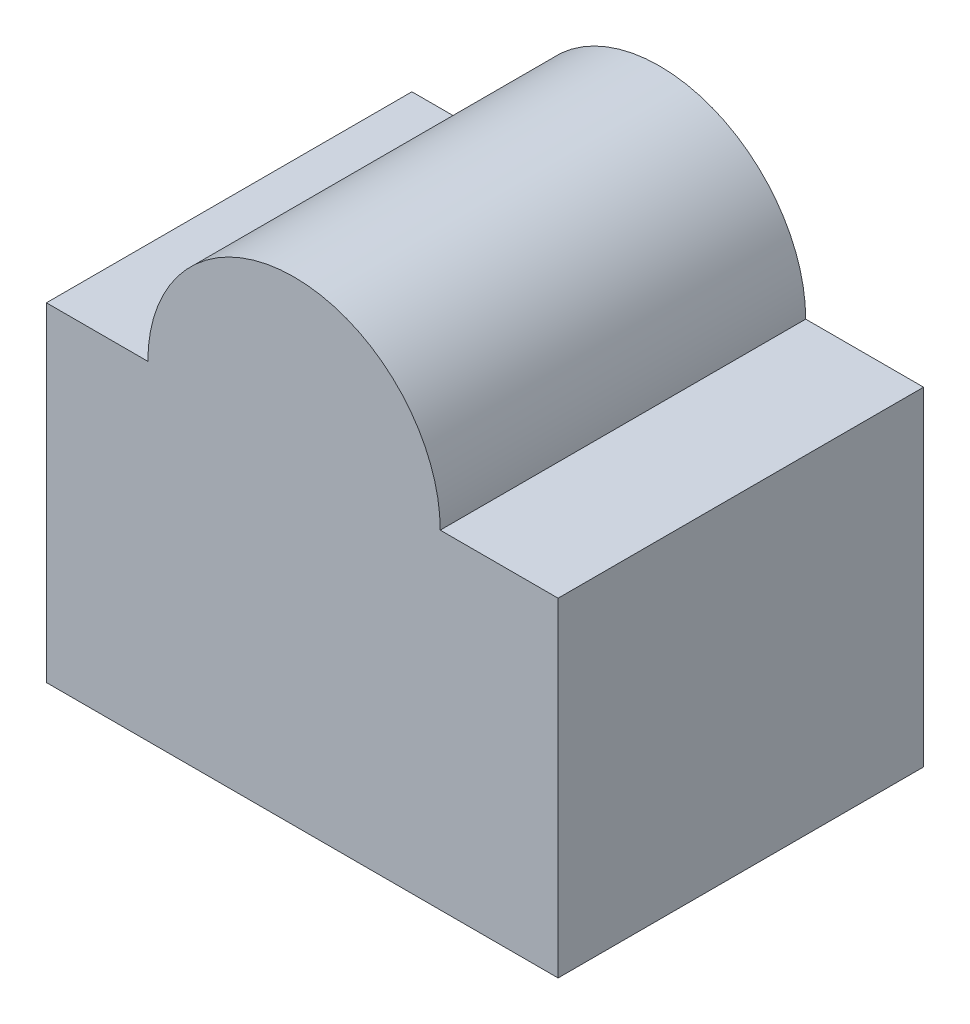
ISO-10303-21;
HEADER;
FILE_DESCRIPTION(('STEP AP214'),'2;1');
FILE_NAME('part.step','',(''),(''),'','','');
FILE_SCHEMA(('AUTOMOTIVE_DESIGN { 1 0 10303 214 1 1 1 1 }'));
ENDSEC;
DATA;
#1=APPLICATION_CONTEXT('core data for automotive mechanical design processes');
#2=APPLICATION_PROTOCOL_DEFINITION('international standard','automotive_design',2000,#1);
#3=PRODUCT_CONTEXT('',#1,'mechanical');
#4=PRODUCT('Part','Part','',(#3));
#5=PRODUCT_RELATED_PRODUCT_CATEGORY('part','',(#4));
#6=PRODUCT_DEFINITION_FORMATION('','',#4);
#7=PRODUCT_DEFINITION_CONTEXT('part definition',#1,'design');
#8=PRODUCT_DEFINITION('design','',#6,#7);
#9=PRODUCT_DEFINITION_SHAPE('','',#8);
#10=(LENGTH_UNIT() NAMED_UNIT(*) SI_UNIT(.MILLI.,.METRE.));
#11=(NAMED_UNIT(*) PLANE_ANGLE_UNIT() SI_UNIT($,.RADIAN.));
#12=(NAMED_UNIT(*) SI_UNIT($,.STERADIAN.) SOLID_ANGLE_UNIT());
#13=UNCERTAINTY_MEASURE_WITH_UNIT(LENGTH_MEASURE(1.E-05),#10,'distance_accuracy_value','');
#14=(GEOMETRIC_REPRESENTATION_CONTEXT(3) GLOBAL_UNCERTAINTY_ASSIGNED_CONTEXT((#13)) GLOBAL_UNIT_ASSIGNED_CONTEXT((#10,
#11,#12)) REPRESENTATION_CONTEXT('',''));
#15=CARTESIAN_POINT('',(0.,0.,0.));
#16=DIRECTION('',(0.,0.,1.));
#17=DIRECTION('',(1.,0.,0.));
#18=AXIS2_PLACEMENT_3D('',#15,#16,#17);
#19=CARTESIAN_POINT('',(0.,0.,500.));
#20=DIRECTION('',(1.,0.,0.));
#21=DIRECTION('',(0.,0.,-1.));
#22=AXIS2_PLACEMENT_3D('',#19,#20,#21);
#23=PLANE('',#22);
#24=DIRECTION('',(0.,-1.,0.));
#25=VECTOR('',#24,1.);
#26=CARTESIAN_POINT('',(0.,0.,0.));
#27=LINE('',#26,#25);
#28=CARTESIAN_POINT('',(0.,450.,0.));
#29=VERTEX_POINT('',#28);
#30=CARTESIAN_POINT('',(0.,0.,0.));
#31=VERTEX_POINT('',#30);
#32=EDGE_CURVE('E117',#29,#31,#27,.T.);
#33=ORIENTED_EDGE('',*,*,#32,.T.);
#34=DIRECTION('',(0.,0.,-1.));
#35=VECTOR('',#34,1.);
#36=CARTESIAN_POINT('',(0.,0.,500.));
#37=LINE('',#36,#35);
#38=CARTESIAN_POINT('',(0.,0.,500.));
#39=VERTEX_POINT('',#38);
#40=EDGE_CURVE('E11',#39,#31,#37,.T.);
#41=ORIENTED_EDGE('',*,*,#40,.F.);
#42=DIRECTION('',(0.,-1.,0.));
#43=VECTOR('',#42,1.);
#44=CARTESIAN_POINT('',(0.,0.,500.));
#45=LINE('',#44,#43);
#46=CARTESIAN_POINT('',(0.,450.,500.));
#47=VERTEX_POINT('',#46);
#48=EDGE_CURVE('E127',#47,#39,#45,.T.);
#49=ORIENTED_EDGE('',*,*,#48,.F.);
#50=DIRECTION('',(0.,0.,-1.));
#51=VECTOR('',#50,1.);
#52=CARTESIAN_POINT('',(0.,450.,500.));
#53=LINE('',#52,#51);
#54=EDGE_CURVE('E113',#47,#29,#53,.T.);
#55=ORIENTED_EDGE('',*,*,#54,.T.);
#56=EDGE_LOOP('',(#33,#41,#49,#55));
#57=FACE_BOUND('',#56,.T.);
#58=ADVANCED_FACE('F33',(#57),#23,.F.);
#59=CARTESIAN_POINT('',(0.,0.,500.));
#60=DIRECTION('',(0.,1.,0.));
#61=DIRECTION('',(0.,0.,1.));
#62=AXIS2_PLACEMENT_3D('',#59,#60,#61);
#63=PLANE('',#62);
#64=DIRECTION('',(1.,0.,0.));
#65=VECTOR('',#64,1.);
#66=CARTESIAN_POINT('',(0.,0.,0.));
#67=LINE('',#66,#65);
#68=CARTESIAN_POINT('',(700.,0.,0.));
#69=VERTEX_POINT('',#68);
#70=EDGE_CURVE('E120',#31,#69,#67,.T.);
#71=ORIENTED_EDGE('',*,*,#70,.T.);
#72=DIRECTION('',(0.,0.,-1.));
#73=VECTOR('',#72,1.);
#74=CARTESIAN_POINT('',(700.,0.,500.));
#75=LINE('',#74,#73);
#76=CARTESIAN_POINT('',(700.,0.,500.));
#77=VERTEX_POINT('',#76);
#78=EDGE_CURVE('E41',#77,#69,#75,.T.);
#79=ORIENTED_EDGE('',*,*,#78,.F.);
#80=DIRECTION('',(1.,0.,0.));
#81=VECTOR('',#80,1.);
#82=CARTESIAN_POINT('',(0.,0.,500.));
#83=LINE('',#82,#81);
#84=EDGE_CURVE('E86',#39,#77,#83,.T.);
#85=ORIENTED_EDGE('',*,*,#84,.F.);
#86=ORIENTED_EDGE('',*,*,#40,.T.);
#87=EDGE_LOOP('',(#71,#79,#85,#86));
#88=FACE_BOUND('',#87,.T.);
#89=ADVANCED_FACE('F151',(#88),#63,.F.);
#90=CARTESIAN_POINT('',(700.,0.,500.));
#91=DIRECTION('',(-1.,0.,0.));
#92=DIRECTION('',(0.,0.,1.));
#93=AXIS2_PLACEMENT_3D('',#90,#91,#92);
#94=PLANE('',#93);
#95=DIRECTION('',(0.,1.,0.));
#96=VECTOR('',#95,1.);
#97=CARTESIAN_POINT('',(700.,0.,0.));
#98=LINE('',#97,#96);
#99=CARTESIAN_POINT('',(700.,450.,0.));
#100=VERTEX_POINT('',#99);
#101=EDGE_CURVE('E122',#69,#100,#98,.T.);
#102=ORIENTED_EDGE('',*,*,#101,.T.);
#103=DIRECTION('',(0.,0.,-1.));
#104=VECTOR('',#103,1.);
#105=CARTESIAN_POINT('',(700.,450.,500.));
#106=LINE('',#105,#104);
#107=CARTESIAN_POINT('',(700.,450.,500.));
#108=VERTEX_POINT('',#107);
#109=EDGE_CURVE('E108',#108,#100,#106,.T.);
#110=ORIENTED_EDGE('',*,*,#109,.F.);
#111=DIRECTION('',(0.,1.,0.));
#112=VECTOR('',#111,1.);
#113=CARTESIAN_POINT('',(700.,0.,500.));
#114=LINE('',#113,#112);
#115=EDGE_CURVE('E99',#77,#108,#114,.T.);
#116=ORIENTED_EDGE('',*,*,#115,.F.);
#117=ORIENTED_EDGE('',*,*,#78,.T.);
#118=EDGE_LOOP('',(#102,#110,#116,#117));
#119=FACE_BOUND('',#118,.T.);
#120=ADVANCED_FACE('F133',(#119),#94,.F.);
#121=CARTESIAN_POINT('',(700.,450.,500.));
#122=DIRECTION('',(0.,-1.,0.));
#123=DIRECTION('',(0.,0.,-1.));
#124=AXIS2_PLACEMENT_3D('',#121,#122,#123);
#125=PLANE('',#124);
#126=DIRECTION('',(-1.,0.,0.));
#127=VECTOR('',#126,1.);
#128=CARTESIAN_POINT('',(700.,450.,0.));
#129=LINE('',#128,#127);
#130=CARTESIAN_POINT('',(538.758062096895,450.,0.));
#131=VERTEX_POINT('',#130);
#132=EDGE_CURVE('E107',#100,#131,#129,.T.);
#133=ORIENTED_EDGE('',*,*,#132,.T.);
#134=DIRECTION('',(0.,0.,-1.));
#135=VECTOR('',#134,1.);
#136=CARTESIAN_POINT('',(538.758062096895,450.,500.));
#137=LINE('',#136,#135);
#138=CARTESIAN_POINT('',(538.758062096895,450.,500.));
#139=VERTEX_POINT('',#138);
#140=EDGE_CURVE('E104',#139,#131,#137,.T.);
#141=ORIENTED_EDGE('',*,*,#140,.F.);
#142=DIRECTION('',(-1.,0.,0.));
#143=VECTOR('',#142,1.);
#144=CARTESIAN_POINT('',(700.,450.,500.));
#145=LINE('',#144,#143);
#146=EDGE_CURVE('E93',#108,#139,#145,.T.);
#147=ORIENTED_EDGE('',*,*,#146,.F.);
#148=ORIENTED_EDGE('',*,*,#109,.T.);
#149=EDGE_LOOP('',(#133,#141,#147,#148));
#150=FACE_BOUND('',#149,.T.);
#151=ADVANCED_FACE('F105',(#150),#125,.F.);
#152=CARTESIAN_POINT('',(338.758062096895,450.,500.));
#153=DIRECTION('',(0.,0.,-1.));
#154=DIRECTION('',(-1.,0.,0.));
#155=AXIS2_PLACEMENT_3D('',#152,#153,#154);
#156=CYLINDRICAL_SURFACE('',#155,200.);
#157=CARTESIAN_POINT('',(338.758062096895,450.,0.));
#158=DIRECTION('',(0.,0.,1.));
#159=DIRECTION('',(1.,0.,0.));
#160=AXIS2_PLACEMENT_3D('',#157,#158,#159);
#161=CIRCLE('',#160,200.);
#162=CARTESIAN_POINT('',(138.758062096895,450.,0.));
#163=VERTEX_POINT('',#162);
#164=EDGE_CURVE('E72',#131,#163,#161,.T.);
#165=ORIENTED_EDGE('',*,*,#164,.T.);
#166=DIRECTION('',(0.,0.,-1.));
#167=VECTOR('',#166,1.);
#168=CARTESIAN_POINT('',(138.758062096895,450.,500.));
#169=LINE('',#168,#167);
#170=CARTESIAN_POINT('',(138.758062096895,450.,500.));
#171=VERTEX_POINT('',#170);
#172=EDGE_CURVE('E109',#171,#163,#169,.T.);
#173=ORIENTED_EDGE('',*,*,#172,.F.);
#174=CARTESIAN_POINT('',(338.758062096895,450.,500.));
#175=DIRECTION('',(0.,0.,1.));
#176=DIRECTION('',(1.,0.,0.));
#177=AXIS2_PLACEMENT_3D('',#174,#175,#176);
#178=CIRCLE('',#177,200.);
#179=EDGE_CURVE('E97',#139,#171,#178,.T.);
#180=ORIENTED_EDGE('',*,*,#179,.F.);
#181=ORIENTED_EDGE('',*,*,#140,.T.);
#182=EDGE_LOOP('',(#165,#173,#180,#181));
#183=FACE_BOUND('',#182,.T.);
#184=ADVANCED_FACE('F111',(#183),#156,.T.);
#185=CARTESIAN_POINT('',(0.,450.,500.));
#186=DIRECTION('',(0.,-1.,0.));
#187=DIRECTION('',(0.,0.,-1.));
#188=AXIS2_PLACEMENT_3D('',#185,#186,#187);
#189=PLANE('',#188);
#190=DIRECTION('',(-1.,0.,0.));
#191=VECTOR('',#190,1.);
#192=CARTESIAN_POINT('',(0.,450.,0.));
#193=LINE('',#192,#191);
#194=EDGE_CURVE('E78',#163,#29,#193,.T.);
#195=ORIENTED_EDGE('',*,*,#194,.T.);
#196=ORIENTED_EDGE('',*,*,#54,.F.);
#197=DIRECTION('',(-1.,0.,0.));
#198=VECTOR('',#197,1.);
#199=CARTESIAN_POINT('',(0.,450.,500.));
#200=LINE('',#199,#198);
#201=EDGE_CURVE('E49',#171,#47,#200,.T.);
#202=ORIENTED_EDGE('',*,*,#201,.F.);
#203=ORIENTED_EDGE('',*,*,#172,.T.);
#204=EDGE_LOOP('',(#195,#196,#202,#203));
#205=FACE_BOUND('',#204,.T.);
#206=ADVANCED_FACE('F140',(#205),#189,.F.);
#207=CARTESIAN_POINT('',(338.758062096895,450.,500.));
#208=DIRECTION('',(0.,0.,1.));
#209=DIRECTION('',(1.,0.,0.));
#210=AXIS2_PLACEMENT_3D('',#207,#208,#209);
#211=PLANE('',#210);
#212=ORIENTED_EDGE('',*,*,#48,.T.);
#213=ORIENTED_EDGE('',*,*,#84,.T.);
#214=ORIENTED_EDGE('',*,*,#115,.T.);
#215=ORIENTED_EDGE('',*,*,#146,.T.);
#216=ORIENTED_EDGE('',*,*,#179,.T.);
#217=ORIENTED_EDGE('',*,*,#201,.T.);
#218=EDGE_LOOP('',(#212,#213,#214,#215,#216,#217));
#219=FACE_BOUND('',#218,.T.);
#220=ADVANCED_FACE('F95',(#219),#211,.T.);
#221=CARTESIAN_POINT('',(338.758062096895,450.,0.));
#222=DIRECTION('',(0.,0.,1.));
#223=DIRECTION('',(1.,0.,0.));
#224=AXIS2_PLACEMENT_3D('',#221,#222,#223);
#225=PLANE('',#224);
#226=ORIENTED_EDGE('',*,*,#32,.F.);
#227=ORIENTED_EDGE('',*,*,#194,.F.);
#228=ORIENTED_EDGE('',*,*,#164,.F.);
#229=ORIENTED_EDGE('',*,*,#132,.F.);
#230=ORIENTED_EDGE('',*,*,#101,.F.);
#231=ORIENTED_EDGE('',*,*,#70,.F.);
#232=EDGE_LOOP('',(#226,#227,#228,#229,#230,#231));
#233=FACE_BOUND('',#232,.T.);
#234=ADVANCED_FACE('F136',(#233),#225,.F.);
#235=CLOSED_SHELL('',(#58,#89,#120,#151,#184,#206,#220,#234));
#236=MANIFOLD_SOLID_BREP('B2',#235);
#237=ADVANCED_BREP_SHAPE_REPRESENTATION('',(#18,#236),#14);
#238=SHAPE_DEFINITION_REPRESENTATION(#9,#237);
ENDSEC;
END-ISO-10303-21;
